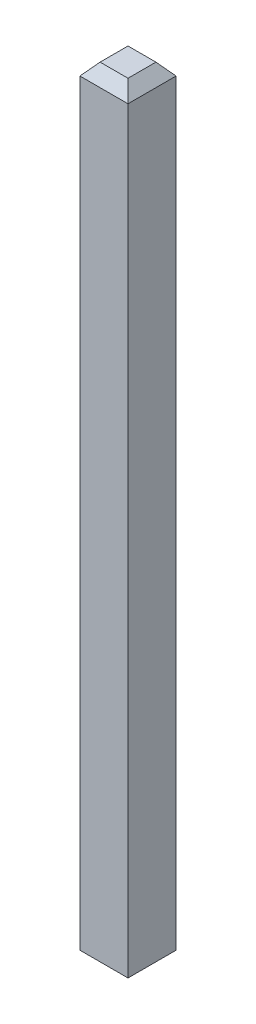
ISO-10303-21;
HEADER;
FILE_DESCRIPTION(('STEP AP214'),'2;1');
FILE_NAME('part.step','',(''),(''),'','','');
FILE_SCHEMA(('AUTOMOTIVE_DESIGN { 1 0 10303 214 1 1 1 1 }'));
ENDSEC;
DATA;
#1=APPLICATION_CONTEXT('core data for automotive mechanical design processes');
#2=APPLICATION_PROTOCOL_DEFINITION('international standard','automotive_design',2000,#1);
#3=PRODUCT_CONTEXT('',#1,'mechanical');
#4=PRODUCT('Part','Part','',(#3));
#5=PRODUCT_RELATED_PRODUCT_CATEGORY('part','',(#4));
#6=PRODUCT_DEFINITION_FORMATION('','',#4);
#7=PRODUCT_DEFINITION_CONTEXT('part definition',#1,'design');
#8=PRODUCT_DEFINITION('design','',#6,#7);
#9=PRODUCT_DEFINITION_SHAPE('','',#8);
#10=(LENGTH_UNIT() NAMED_UNIT(*) SI_UNIT(.MILLI.,.METRE.));
#11=(NAMED_UNIT(*) PLANE_ANGLE_UNIT() SI_UNIT($,.RADIAN.));
#12=(NAMED_UNIT(*) SI_UNIT($,.STERADIAN.) SOLID_ANGLE_UNIT());
#13=UNCERTAINTY_MEASURE_WITH_UNIT(LENGTH_MEASURE(1.E-05),#10,'distance_accuracy_value','');
#14=(GEOMETRIC_REPRESENTATION_CONTEXT(3) GLOBAL_UNCERTAINTY_ASSIGNED_CONTEXT((#13)) GLOBAL_UNIT_ASSIGNED_CONTEXT((#10,
#11,#12)) REPRESENTATION_CONTEXT('',''));
#15=CARTESIAN_POINT('',(0.,0.,0.));
#16=DIRECTION('',(0.,0.,1.));
#17=DIRECTION('',(1.,0.,0.));
#18=AXIS2_PLACEMENT_3D('',#15,#16,#17);
#19=CARTESIAN_POINT('',(-0.145112546103,8.1,0.));
#20=DIRECTION('',(0.76604444311876,-0.642787609686799,0.));
#21=DIRECTION('',(0.642787609686799,0.76604444311876,0.));
#22=AXIS2_PLACEMENT_3D('',#19,#20,#21);
#23=PLANE('',#22);
#24=DIRECTION('',(0.,0.,-1.));
#25=VECTOR('',#24,1.);
#26=CARTESIAN_POINT('',(-0.25,7.975,0.25));
#27=LINE('',#26,#25);
#28=CARTESIAN_POINT('',(-0.250000000000068,7.97500000000009,-0.250000000000034));
#29=VERTEX_POINT('',#28);
#30=CARTESIAN_POINT('',(-0.250000000000068,7.97500000000009,0.250000000000034));
#31=VERTEX_POINT('',#30);
#32=EDGE_CURVE('E119',#29,#31,#27,.F.);
#33=ORIENTED_EDGE('',*,*,#32,.T.);
#34=DIRECTION('',(0.540716203060594,0.644400477571757,-0.540716203061297));
#35=VECTOR('',#34,1.);
#36=CARTESIAN_POINT('',(-0.25,7.97500000000011,0.250000000000136));
#37=LINE('',#36,#35);
#38=CARTESIAN_POINT('',(-0.145112546103,8.1,0.145112546103));
#39=VERTEX_POINT('',#38);
#40=EDGE_CURVE('E90',#31,#39,#37,.T.);
#41=ORIENTED_EDGE('',*,*,#40,.T.);
#42=DIRECTION('',(0.,0.,-1.));
#43=VECTOR('',#42,1.);
#44=CARTESIAN_POINT('',(-0.145112546103,8.1,0.));
#45=LINE('',#44,#43);
#46=CARTESIAN_POINT('',(-0.145112546103,8.1,-0.145112546103));
#47=VERTEX_POINT('',#46);
#48=EDGE_CURVE('E20',#39,#47,#45,.T.);
#49=ORIENTED_EDGE('',*,*,#48,.T.);
#50=DIRECTION('',(-0.540716203060594,-0.644400477571757,-0.540716203061297));
#51=VECTOR('',#50,1.);
#52=CARTESIAN_POINT('',(-0.145112546103,8.1,-0.145112546103));
#53=LINE('',#52,#51);
#54=EDGE_CURVE('E88',#47,#29,#53,.T.);
#55=ORIENTED_EDGE('',*,*,#54,.T.);
#56=EDGE_LOOP('',(#33,#41,#49,#55));
#57=FACE_BOUND('',#56,.T.);
#58=ADVANCED_FACE('F17',(#57),#23,.F.);
#59=CARTESIAN_POINT('',(-0.25,0.104887453897,0.25));
#60=DIRECTION('',(-0.642787609686799,-0.76604444311876,0.));
#61=DIRECTION('',(0.76604444311876,-0.642787609686799,0.));
#62=AXIS2_PLACEMENT_3D('',#59,#60,#61);
#63=PLANE('',#62);
#64=DIRECTION('',(-0.608120402411584,0.510273605374824,-0.608120402411028));
#65=VECTOR('',#64,1.);
#66=CARTESIAN_POINT('',(-0.125,-1.3624355549996E-13,-0.125000000000114));
#67=LINE('',#66,#65);
#68=CARTESIAN_POINT('',(-0.125000000000029,0.,-0.125000000000029));
#69=VERTEX_POINT('',#68);
#70=CARTESIAN_POINT('',(-0.25,0.104887453897,-0.25));
#71=VERTEX_POINT('',#70);
#72=EDGE_CURVE('E110',#69,#71,#67,.T.);
#73=ORIENTED_EDGE('',*,*,#72,.F.);
#74=DIRECTION('',(0.,0.,-1.));
#75=VECTOR('',#74,1.);
#76=CARTESIAN_POINT('',(-0.125,0.,0.));
#77=LINE('',#76,#75);
#78=CARTESIAN_POINT('',(-0.125000000000057,-1.0218266662497E-13,0.125000000000029));
#79=VERTEX_POINT('',#78);
#80=EDGE_CURVE('E80',#79,#69,#77,.T.);
#81=ORIENTED_EDGE('',*,*,#80,.F.);
#82=DIRECTION('',(0.608120402411584,-0.510273605374824,-0.608120402411028));
#83=VECTOR('',#82,1.);
#84=CARTESIAN_POINT('',(-0.25,0.104887453897,0.25));
#85=LINE('',#84,#83);
#86=CARTESIAN_POINT('',(-0.25,0.104887453897,0.25));
#87=VERTEX_POINT('',#86);
#88=EDGE_CURVE('E115',#87,#79,#85,.T.);
#89=ORIENTED_EDGE('',*,*,#88,.F.);
#90=DIRECTION('',(0.,0.,-1.));
#91=VECTOR('',#90,1.);
#92=CARTESIAN_POINT('',(-0.25,0.104887453897,0.25));
#93=LINE('',#92,#91);
#94=EDGE_CURVE('E121',#87,#71,#93,.T.);
#95=ORIENTED_EDGE('',*,*,#94,.T.);
#96=EDGE_LOOP('',(#73,#81,#89,#95));
#97=FACE_BOUND('',#96,.T.);
#98=ADVANCED_FACE('F211',(#97),#63,.T.);
#99=CARTESIAN_POINT('',(0.,8.1,0.));
#100=DIRECTION('',(0.,-1.,0.));
#101=DIRECTION('',(0.,0.,-1.));
#102=AXIS2_PLACEMENT_3D('',#99,#100,#101);
#103=PLANE('',#102);
#104=DIRECTION('',(1.,0.,0.));
#105=VECTOR('',#104,1.);
#106=CARTESIAN_POINT('',(0.,8.1,0.145112546103));
#107=LINE('',#106,#105);
#108=CARTESIAN_POINT('',(0.145112546103,8.1,0.145112546103));
#109=VERTEX_POINT('',#108);
#110=EDGE_CURVE('E112',#39,#109,#107,.T.);
#111=ORIENTED_EDGE('',*,*,#110,.T.);
#112=DIRECTION('',(0.,0.,1.));
#113=VECTOR('',#112,1.);
#114=CARTESIAN_POINT('',(0.145112546103,8.1,0.));
#115=LINE('',#114,#113);
#116=CARTESIAN_POINT('',(0.145112546103,8.1,-0.145112546103));
#117=VERTEX_POINT('',#116);
#118=EDGE_CURVE('E105',#109,#117,#115,.F.);
#119=ORIENTED_EDGE('',*,*,#118,.T.);
#120=DIRECTION('',(1.,0.,0.));
#121=VECTOR('',#120,1.);
#122=CARTESIAN_POINT('',(0.,8.1,-0.145112546103));
#123=LINE('',#122,#121);
#124=EDGE_CURVE('E94',#117,#47,#123,.F.);
#125=ORIENTED_EDGE('',*,*,#124,.T.);
#126=ORIENTED_EDGE('',*,*,#48,.F.);
#127=EDGE_LOOP('',(#111,#119,#125,#126));
#128=FACE_BOUND('',#127,.T.);
#129=ADVANCED_FACE('F103',(#128),#103,.F.);
#130=CARTESIAN_POINT('',(0.,8.1,-0.145112546103));
#131=DIRECTION('',(0.,-0.642787609686799,0.76604444311876));
#132=DIRECTION('',(0.,-0.76604444311876,-0.642787609686799));
#133=AXIS2_PLACEMENT_3D('',#130,#131,#132);
#134=PLANE('',#133);
#135=DIRECTION('',(1.,0.,0.));
#136=VECTOR('',#135,1.);
#137=CARTESIAN_POINT('',(-0.25,7.975,-0.25));
#138=LINE('',#137,#136);
#139=CARTESIAN_POINT('',(0.250000000000034,7.97500000000009,-0.250000000000068));
#140=VERTEX_POINT('',#139);
#141=EDGE_CURVE('E100',#140,#29,#138,.F.);
#142=ORIENTED_EDGE('',*,*,#141,.T.);
#143=ORIENTED_EDGE('',*,*,#54,.F.);
#144=ORIENTED_EDGE('',*,*,#124,.F.);
#145=DIRECTION('',(0.540716203061297,-0.644400477571757,-0.540716203060594));
#146=VECTOR('',#145,1.);
#147=CARTESIAN_POINT('',(0.145112546103,8.1,-0.145112546103));
#148=LINE('',#147,#146);
#149=EDGE_CURVE('E128',#117,#140,#148,.T.);
#150=ORIENTED_EDGE('',*,*,#149,.T.);
#151=EDGE_LOOP('',(#142,#143,#144,#150));
#152=FACE_BOUND('',#151,.T.);
#153=ADVANCED_FACE('F97',(#152),#134,.F.);
#154=CARTESIAN_POINT('',(0.,0.,0.));
#155=DIRECTION('',(0.,-1.,0.));
#156=DIRECTION('',(0.,0.,-1.));
#157=AXIS2_PLACEMENT_3D('',#154,#155,#156);
#158=PLANE('',#157);
#159=DIRECTION('',(0.,0.,1.));
#160=VECTOR('',#159,1.);
#161=CARTESIAN_POINT('',(0.125000000000114,-1.3624355549996E-13,0.25));
#162=LINE('',#161,#160);
#163=CARTESIAN_POINT('',(0.125000000000029,-1.0218266662497E-13,0.125000000000057));
#164=VERTEX_POINT('',#163);
#165=CARTESIAN_POINT('',(0.125000000000029,0.,-0.125000000000029));
#166=VERTEX_POINT('',#165);
#167=EDGE_CURVE('E140',#164,#166,#162,.F.);
#168=ORIENTED_EDGE('',*,*,#167,.F.);
#169=DIRECTION('',(1.,0.,0.));
#170=VECTOR('',#169,1.);
#171=CARTESIAN_POINT('',(-0.25,-1.3624355549996E-13,0.125000000000114));
#172=LINE('',#171,#170);
#173=EDGE_CURVE('E117',#79,#164,#172,.T.);
#174=ORIENTED_EDGE('',*,*,#173,.F.);
#175=ORIENTED_EDGE('',*,*,#80,.T.);
#176=DIRECTION('',(1.,0.,0.));
#177=VECTOR('',#176,1.);
#178=CARTESIAN_POINT('',(-0.25,-1.3624355549996E-13,-0.125000000000114));
#179=LINE('',#178,#177);
#180=EDGE_CURVE('E108',#166,#69,#179,.F.);
#181=ORIENTED_EDGE('',*,*,#180,.F.);
#182=EDGE_LOOP('',(#168,#174,#175,#181));
#183=FACE_BOUND('',#182,.T.);
#184=ADVANCED_FACE('F204',(#183),#158,.T.);
#185=CARTESIAN_POINT('',(-0.25,0.104887453897,-0.25));
#186=DIRECTION('',(0.,-0.76604444311876,-0.642787609686799));
#187=DIRECTION('',(0.,0.642787609686799,-0.76604444311876));
#188=AXIS2_PLACEMENT_3D('',#185,#186,#187);
#189=PLANE('',#188);
#190=ORIENTED_EDGE('',*,*,#72,.T.);
#191=DIRECTION('',(1.,0.,0.));
#192=VECTOR('',#191,1.);
#193=CARTESIAN_POINT('',(-0.25,0.104887453897,-0.25));
#194=LINE('',#193,#192);
#195=CARTESIAN_POINT('',(0.25,0.104887453897,-0.25));
#196=VERTEX_POINT('',#195);
#197=EDGE_CURVE('E134',#71,#196,#194,.T.);
#198=ORIENTED_EDGE('',*,*,#197,.T.);
#199=DIRECTION('',(0.608120402411028,0.510273605374824,-0.608120402411584));
#200=VECTOR('',#199,1.);
#201=CARTESIAN_POINT('',(0.125000000000114,-1.3624355549996E-13,-0.125));
#202=LINE('',#201,#200);
#203=EDGE_CURVE('E142',#166,#196,#202,.T.);
#204=ORIENTED_EDGE('',*,*,#203,.F.);
#205=ORIENTED_EDGE('',*,*,#180,.T.);
#206=EDGE_LOOP('',(#190,#198,#204,#205));
#207=FACE_BOUND('',#206,.T.);
#208=ADVANCED_FACE('F201',(#207),#189,.T.);
#209=CARTESIAN_POINT('',(0.,8.1,0.145112546103));
#210=DIRECTION('',(0.,-0.642787609686799,-0.76604444311876));
#211=DIRECTION('',(0.,0.76604444311876,-0.642787609686799));
#212=AXIS2_PLACEMENT_3D('',#209,#210,#211);
#213=PLANE('',#212);
#214=DIRECTION('',(-1.,0.,0.));
#215=VECTOR('',#214,1.);
#216=CARTESIAN_POINT('',(-0.25,7.975,0.25));
#217=LINE('',#216,#215);
#218=CARTESIAN_POINT('',(0.250000000000034,7.97500000000009,0.250000000000068));
#219=VERTEX_POINT('',#218);
#220=EDGE_CURVE('E144',#31,#219,#217,.F.);
#221=ORIENTED_EDGE('',*,*,#220,.T.);
#222=DIRECTION('',(-0.540716203061297,0.644400477571757,-0.540716203060594));
#223=VECTOR('',#222,1.);
#224=CARTESIAN_POINT('',(0.250000000000136,7.97500000000011,0.25));
#225=LINE('',#224,#223);
#226=EDGE_CURVE('E124',#219,#109,#225,.T.);
#227=ORIENTED_EDGE('',*,*,#226,.T.);
#228=ORIENTED_EDGE('',*,*,#110,.F.);
#229=ORIENTED_EDGE('',*,*,#40,.F.);
#230=EDGE_LOOP('',(#221,#227,#228,#229));
#231=FACE_BOUND('',#230,.T.);
#232=ADVANCED_FACE('F175',(#231),#213,.F.);
#233=CARTESIAN_POINT('',(-0.25,0.104887453897,0.25));
#234=DIRECTION('',(0.,-0.76604444311876,0.642787609686799));
#235=DIRECTION('',(0.,-0.642787609686799,-0.76604444311876));
#236=AXIS2_PLACEMENT_3D('',#233,#234,#235);
#237=PLANE('',#236);
#238=DIRECTION('',(-0.608120402411028,-0.510273605374824,-0.608120402411584));
#239=VECTOR('',#238,1.);
#240=CARTESIAN_POINT('',(0.25,0.104887453897,0.25));
#241=LINE('',#240,#239);
#242=CARTESIAN_POINT('',(0.25,0.104887453897,0.25));
#243=VERTEX_POINT('',#242);
#244=EDGE_CURVE('E137',#243,#164,#241,.T.);
#245=ORIENTED_EDGE('',*,*,#244,.F.);
#246=DIRECTION('',(-1.,0.,0.));
#247=VECTOR('',#246,1.);
#248=CARTESIAN_POINT('',(-0.25,0.104887453897,0.25));
#249=LINE('',#248,#247);
#250=EDGE_CURVE('E34',#243,#87,#249,.T.);
#251=ORIENTED_EDGE('',*,*,#250,.T.);
#252=ORIENTED_EDGE('',*,*,#88,.T.);
#253=ORIENTED_EDGE('',*,*,#173,.T.);
#254=EDGE_LOOP('',(#245,#251,#252,#253));
#255=FACE_BOUND('',#254,.T.);
#256=ADVANCED_FACE('F194',(#255),#237,.T.);
#257=CARTESIAN_POINT('',(-0.25,8.1,0.25));
#258=DIRECTION('',(1.,0.,0.));
#259=DIRECTION('',(0.,0.,-1.));
#260=AXIS2_PLACEMENT_3D('',#257,#258,#259);
#261=PLANE('',#260);
#262=ORIENTED_EDGE('',*,*,#94,.F.);
#263=DIRECTION('',(0.,1.,0.));
#264=VECTOR('',#263,1.);
#265=CARTESIAN_POINT('',(-0.25,8.1,0.25));
#266=LINE('',#265,#264);
#267=EDGE_CURVE('E148',#87,#31,#266,.T.);
#268=ORIENTED_EDGE('',*,*,#267,.T.);
#269=ORIENTED_EDGE('',*,*,#32,.F.);
#270=DIRECTION('',(0.,1.,0.));
#271=VECTOR('',#270,1.);
#272=CARTESIAN_POINT('',(-0.25,8.1,-0.25));
#273=LINE('',#272,#271);
#274=EDGE_CURVE('E131',#29,#71,#273,.F.);
#275=ORIENTED_EDGE('',*,*,#274,.T.);
#276=EDGE_LOOP('',(#262,#268,#269,#275));
#277=FACE_BOUND('',#276,.T.);
#278=ADVANCED_FACE('F191',(#277),#261,.F.);
#279=CARTESIAN_POINT('',(0.145112546103,8.1,0.));
#280=DIRECTION('',(-0.76604444311876,-0.642787609686799,0.));
#281=DIRECTION('',(0.642787609686799,-0.76604444311876,0.));
#282=AXIS2_PLACEMENT_3D('',#279,#280,#281);
#283=PLANE('',#282);
#284=ORIENTED_EDGE('',*,*,#118,.F.);
#285=ORIENTED_EDGE('',*,*,#226,.F.);
#286=DIRECTION('',(0.,0.,1.));
#287=VECTOR('',#286,1.);
#288=CARTESIAN_POINT('',(0.25,7.975,0.25));
#289=LINE('',#288,#287);
#290=EDGE_CURVE('E151',#219,#140,#289,.F.);
#291=ORIENTED_EDGE('',*,*,#290,.T.);
#292=ORIENTED_EDGE('',*,*,#149,.F.);
#293=EDGE_LOOP('',(#284,#285,#291,#292));
#294=FACE_BOUND('',#293,.T.);
#295=ADVANCED_FACE('F172',(#294),#283,.F.);
#296=CARTESIAN_POINT('',(-0.25,8.1,-0.25));
#297=DIRECTION('',(0.,0.,1.));
#298=DIRECTION('',(1.,0.,0.));
#299=AXIS2_PLACEMENT_3D('',#296,#297,#298);
#300=PLANE('',#299);
#301=ORIENTED_EDGE('',*,*,#197,.F.);
#302=ORIENTED_EDGE('',*,*,#274,.F.);
#303=ORIENTED_EDGE('',*,*,#141,.F.);
#304=DIRECTION('',(0.,1.,0.));
#305=VECTOR('',#304,1.);
#306=CARTESIAN_POINT('',(0.25,8.1,-0.25));
#307=LINE('',#306,#305);
#308=EDGE_CURVE('E154',#140,#196,#307,.F.);
#309=ORIENTED_EDGE('',*,*,#308,.T.);
#310=EDGE_LOOP('',(#301,#302,#303,#309));
#311=FACE_BOUND('',#310,.T.);
#312=ADVANCED_FACE('F170',(#311),#300,.F.);
#313=CARTESIAN_POINT('',(0.25,0.104887453897,0.25));
#314=DIRECTION('',(0.642787609686799,-0.76604444311876,0.));
#315=DIRECTION('',(0.76604444311876,0.642787609686799,0.));
#316=AXIS2_PLACEMENT_3D('',#313,#314,#315);
#317=PLANE('',#316);
#318=ORIENTED_EDGE('',*,*,#203,.T.);
#319=DIRECTION('',(0.,0.,1.));
#320=VECTOR('',#319,1.);
#321=CARTESIAN_POINT('',(0.25,0.104887453897,0.25));
#322=LINE('',#321,#320);
#323=EDGE_CURVE('E26',#196,#243,#322,.T.);
#324=ORIENTED_EDGE('',*,*,#323,.T.);
#325=ORIENTED_EDGE('',*,*,#244,.T.);
#326=ORIENTED_EDGE('',*,*,#167,.T.);
#327=EDGE_LOOP('',(#318,#324,#325,#326));
#328=FACE_BOUND('',#327,.T.);
#329=ADVANCED_FACE('F160',(#328),#317,.T.);
#330=CARTESIAN_POINT('',(-0.25,8.1,0.25));
#331=DIRECTION('',(0.,0.,-1.));
#332=DIRECTION('',(-1.,0.,0.));
#333=AXIS2_PLACEMENT_3D('',#330,#331,#332);
#334=PLANE('',#333);
#335=ORIENTED_EDGE('',*,*,#250,.F.);
#336=DIRECTION('',(0.,1.,0.));
#337=VECTOR('',#336,1.);
#338=CARTESIAN_POINT('',(0.25,8.1,0.25));
#339=LINE('',#338,#337);
#340=EDGE_CURVE('E11',#243,#219,#339,.T.);
#341=ORIENTED_EDGE('',*,*,#340,.T.);
#342=ORIENTED_EDGE('',*,*,#220,.F.);
#343=ORIENTED_EDGE('',*,*,#267,.F.);
#344=EDGE_LOOP('',(#335,#341,#342,#343));
#345=FACE_BOUND('',#344,.T.);
#346=ADVANCED_FACE('F176',(#345),#334,.F.);
#347=CARTESIAN_POINT('',(0.25,8.1,0.25));
#348=DIRECTION('',(-1.,0.,0.));
#349=DIRECTION('',(0.,0.,1.));
#350=AXIS2_PLACEMENT_3D('',#347,#348,#349);
#351=PLANE('',#350);
#352=ORIENTED_EDGE('',*,*,#323,.F.);
#353=ORIENTED_EDGE('',*,*,#308,.F.);
#354=ORIENTED_EDGE('',*,*,#290,.F.);
#355=ORIENTED_EDGE('',*,*,#340,.F.);
#356=EDGE_LOOP('',(#352,#353,#354,#355));
#357=FACE_BOUND('',#356,.T.);
#358=ADVANCED_FACE('F166',(#357),#351,.F.);
#359=CLOSED_SHELL('',(#58,#98,#129,#153,#184,#208,#232,#256,#278,#295,#312,#329,#346,#358));
#360=MANIFOLD_SOLID_BREP('B1',#359);
#361=ADVANCED_BREP_SHAPE_REPRESENTATION('',(#18,#360),#14);
#362=SHAPE_DEFINITION_REPRESENTATION(#9,#361);
ENDSEC;
END-ISO-10303-21;
